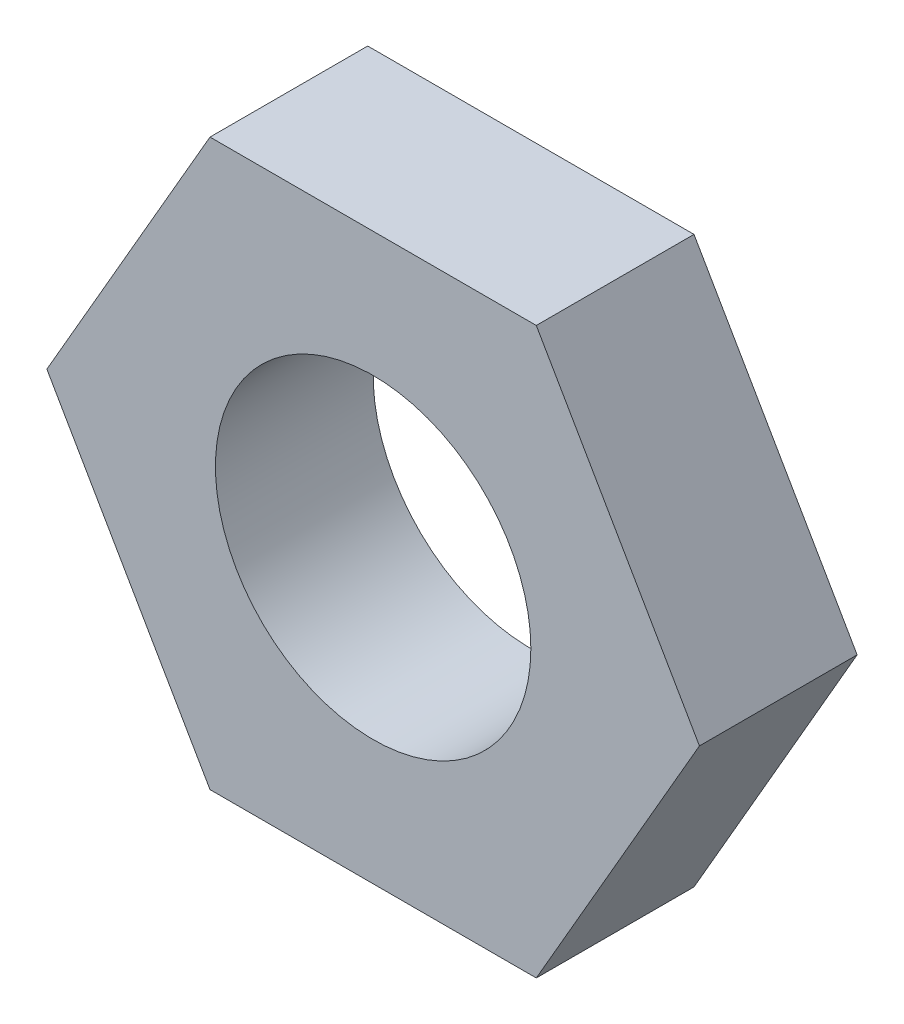
ISO-10303-21;
HEADER;
FILE_DESCRIPTION(('STEP AP214'),'2;1');
FILE_NAME('part.step','',(''),(''),'','','');
FILE_SCHEMA(('AUTOMOTIVE_DESIGN { 1 0 10303 214 1 1 1 1 }'));
ENDSEC;
DATA;
#1=APPLICATION_CONTEXT('core data for automotive mechanical design processes');
#2=APPLICATION_PROTOCOL_DEFINITION('international standard','automotive_design',2000,#1);
#3=PRODUCT_CONTEXT('',#1,'mechanical');
#4=PRODUCT('Part','Part','',(#3));
#5=PRODUCT_RELATED_PRODUCT_CATEGORY('part','',(#4));
#6=PRODUCT_DEFINITION_FORMATION('','',#4);
#7=PRODUCT_DEFINITION_CONTEXT('part definition',#1,'design');
#8=PRODUCT_DEFINITION('design','',#6,#7);
#9=PRODUCT_DEFINITION_SHAPE('','',#8);
#10=(LENGTH_UNIT() NAMED_UNIT(*) SI_UNIT(.MILLI.,.METRE.));
#11=(NAMED_UNIT(*) PLANE_ANGLE_UNIT() SI_UNIT($,.RADIAN.));
#12=(NAMED_UNIT(*) SI_UNIT($,.STERADIAN.) SOLID_ANGLE_UNIT());
#13=UNCERTAINTY_MEASURE_WITH_UNIT(LENGTH_MEASURE(1.E-05),#10,'distance_accuracy_value','');
#14=(GEOMETRIC_REPRESENTATION_CONTEXT(3) GLOBAL_UNCERTAINTY_ASSIGNED_CONTEXT((#13)) GLOBAL_UNIT_ASSIGNED_CONTEXT((#10,
#11,#12)) REPRESENTATION_CONTEXT('',''));
#15=CARTESIAN_POINT('',(0.,0.,0.));
#16=DIRECTION('',(0.,0.,1.));
#17=DIRECTION('',(1.,0.,0.));
#18=AXIS2_PLACEMENT_3D('',#15,#16,#17);
#19=CARTESIAN_POINT('',(0.,0.,3.));
#20=DIRECTION('',(0.,0.,1.));
#21=DIRECTION('',(1.,0.,0.));
#22=AXIS2_PLACEMENT_3D('',#19,#20,#21);
#23=PLANE('',#22);
#24=DIRECTION('',(0.5,0.866025403784439,0.));
#25=VECTOR('',#24,1.);
#26=CARTESIAN_POINT('',(3.10325769689424,-5.37500000000003,3.));
#27=LINE('',#26,#25);
#28=CARTESIAN_POINT('',(3.10325769689424,-5.37500000000003,3.));
#29=VERTEX_POINT('',#28);
#30=CARTESIAN_POINT('',(6.20651539378848,0.,3.));
#31=VERTEX_POINT('',#30);
#32=EDGE_CURVE('E129',#29,#31,#27,.T.);
#33=ORIENTED_EDGE('',*,*,#32,.T.);
#34=DIRECTION('',(-0.5,0.866025403784438,0.));
#35=VECTOR('',#34,1.);
#36=CARTESIAN_POINT('',(6.20651539378848,0.,3.));
#37=LINE('',#36,#35);
#38=CARTESIAN_POINT('',(3.10325769689422,5.375,3.));
#39=VERTEX_POINT('',#38);
#40=EDGE_CURVE('E87',#31,#39,#37,.T.);
#41=ORIENTED_EDGE('',*,*,#40,.T.);
#42=DIRECTION('',(-1.,0.,0.));
#43=VECTOR('',#42,1.);
#44=CARTESIAN_POINT('',(3.10325769689422,5.375,3.));
#45=LINE('',#44,#43);
#46=CARTESIAN_POINT('',(-3.10325769689423,5.375,3.));
#47=VERTEX_POINT('',#46);
#48=EDGE_CURVE('E100',#39,#47,#45,.T.);
#49=ORIENTED_EDGE('',*,*,#48,.T.);
#50=DIRECTION('',(-0.5,-0.866025403784438,0.));
#51=VECTOR('',#50,1.);
#52=CARTESIAN_POINT('',(-3.10325769689423,5.375,3.));
#53=LINE('',#52,#51);
#54=CARTESIAN_POINT('',(-6.20651539378848,0.,3.));
#55=VERTEX_POINT('',#54);
#56=EDGE_CURVE('E94',#47,#55,#53,.T.);
#57=ORIENTED_EDGE('',*,*,#56,.T.);
#58=DIRECTION('',(0.500000000000001,-0.866025403784438,0.));
#59=VECTOR('',#58,1.);
#60=CARTESIAN_POINT('',(-6.20651539378848,0.,3.));
#61=LINE('',#60,#59);
#62=CARTESIAN_POINT('',(-3.10325769689423,-5.37500000000003,3.));
#63=VERTEX_POINT('',#62);
#64=EDGE_CURVE('E98',#55,#63,#61,.T.);
#65=ORIENTED_EDGE('',*,*,#64,.T.);
#66=DIRECTION('',(1.,0.,0.));
#67=VECTOR('',#66,1.);
#68=CARTESIAN_POINT('',(-3.10325769689423,-5.37500000000003,3.));
#69=LINE('',#68,#67);
#70=EDGE_CURVE('E50',#63,#29,#69,.T.);
#71=ORIENTED_EDGE('',*,*,#70,.T.);
#72=EDGE_LOOP('',(#33,#41,#49,#57,#65,#71));
#73=FACE_BOUND('',#72,.T.);
#74=CARTESIAN_POINT('',(0.,0.,3.));
#75=DIRECTION('',(0.,0.,1.));
#76=DIRECTION('',(1.,0.,0.));
#77=AXIS2_PLACEMENT_3D('',#74,#75,#76);
#78=CIRCLE('',#77,3.);
#79=CARTESIAN_POINT('',(3.,0.,3.));
#80=VERTEX_POINT('',#79);
#81=EDGE_CURVE('E122',#80,#80,#78,.T.);
#82=ORIENTED_EDGE('',*,*,#81,.F.);
#83=EDGE_LOOP('',(#82));
#84=FACE_BOUND('',#83,.T.);
#85=ADVANCED_FACE('F33',(#73,#84),#23,.T.);
#86=CARTESIAN_POINT('',(0.,0.,0.));
#87=DIRECTION('',(0.,0.,1.));
#88=DIRECTION('',(1.,0.,0.));
#89=AXIS2_PLACEMENT_3D('',#86,#87,#88);
#90=PLANE('',#89);
#91=DIRECTION('',(0.5,0.866025403784439,0.));
#92=VECTOR('',#91,1.);
#93=CARTESIAN_POINT('',(3.10325769689424,-5.37500000000003,0.));
#94=LINE('',#93,#92);
#95=CARTESIAN_POINT('',(3.10325769689424,-5.37500000000003,0.));
#96=VERTEX_POINT('',#95);
#97=CARTESIAN_POINT('',(6.20651539378848,0.,0.));
#98=VERTEX_POINT('',#97);
#99=EDGE_CURVE('E118',#96,#98,#94,.T.);
#100=ORIENTED_EDGE('',*,*,#99,.F.);
#101=DIRECTION('',(1.,0.,0.));
#102=VECTOR('',#101,1.);
#103=CARTESIAN_POINT('',(-3.10325769689423,-5.37500000000003,0.));
#104=LINE('',#103,#102);
#105=CARTESIAN_POINT('',(-3.10325769689423,-5.37500000000003,0.));
#106=VERTEX_POINT('',#105);
#107=EDGE_CURVE('E79',#106,#96,#104,.T.);
#108=ORIENTED_EDGE('',*,*,#107,.F.);
#109=DIRECTION('',(0.500000000000001,-0.866025403784438,0.));
#110=VECTOR('',#109,1.);
#111=CARTESIAN_POINT('',(-6.20651539378848,0.,0.));
#112=LINE('',#111,#110);
#113=CARTESIAN_POINT('',(-6.20651539378848,0.,0.));
#114=VERTEX_POINT('',#113);
#115=EDGE_CURVE('E73',#114,#106,#112,.T.);
#116=ORIENTED_EDGE('',*,*,#115,.F.);
#117=DIRECTION('',(-0.5,-0.866025403784438,0.));
#118=VECTOR('',#117,1.);
#119=CARTESIAN_POINT('',(-3.10325769689423,5.375,0.));
#120=LINE('',#119,#118);
#121=CARTESIAN_POINT('',(-3.10325769689423,5.375,0.));
#122=VERTEX_POINT('',#121);
#123=EDGE_CURVE('E108',#122,#114,#120,.T.);
#124=ORIENTED_EDGE('',*,*,#123,.F.);
#125=DIRECTION('',(-1.,0.,0.));
#126=VECTOR('',#125,1.);
#127=CARTESIAN_POINT('',(3.10325769689422,5.375,0.));
#128=LINE('',#127,#126);
#129=CARTESIAN_POINT('',(3.10325769689422,5.375,0.));
#130=VERTEX_POINT('',#129);
#131=EDGE_CURVE('E124',#130,#122,#128,.T.);
#132=ORIENTED_EDGE('',*,*,#131,.F.);
#133=DIRECTION('',(-0.5,0.866025403784438,0.));
#134=VECTOR('',#133,1.);
#135=CARTESIAN_POINT('',(6.20651539378848,0.,0.));
#136=LINE('',#135,#134);
#137=EDGE_CURVE('E121',#98,#130,#136,.T.);
#138=ORIENTED_EDGE('',*,*,#137,.F.);
#139=EDGE_LOOP('',(#100,#108,#116,#124,#132,#138));
#140=FACE_BOUND('',#139,.T.);
#141=CARTESIAN_POINT('',(0.,0.,0.));
#142=DIRECTION('',(0.,0.,1.));
#143=DIRECTION('',(1.,0.,0.));
#144=AXIS2_PLACEMENT_3D('',#141,#142,#143);
#145=CIRCLE('',#144,3.);
#146=CARTESIAN_POINT('',(3.,0.,0.));
#147=VERTEX_POINT('',#146);
#148=EDGE_CURVE('E222',#147,#147,#145,.T.);
#149=ORIENTED_EDGE('',*,*,#148,.T.);
#150=EDGE_LOOP('',(#149));
#151=FACE_BOUND('',#150,.T.);
#152=ADVANCED_FACE('F138',(#140,#151),#90,.F.);
#153=CARTESIAN_POINT('',(3.10325769689424,-5.37500000000003,3.));
#154=DIRECTION('',(-0.866025403784439,0.5,0.));
#155=DIRECTION('',(-0.5,-0.866025403784439,0.));
#156=AXIS2_PLACEMENT_3D('',#153,#154,#155);
#157=PLANE('',#156);
#158=ORIENTED_EDGE('',*,*,#99,.T.);
#159=DIRECTION('',(0.,0.,-1.));
#160=VECTOR('',#159,1.);
#161=CARTESIAN_POINT('',(6.20651539378848,0.,3.));
#162=LINE('',#161,#160);
#163=EDGE_CURVE('E11',#31,#98,#162,.T.);
#164=ORIENTED_EDGE('',*,*,#163,.F.);
#165=ORIENTED_EDGE('',*,*,#32,.F.);
#166=DIRECTION('',(0.,0.,-1.));
#167=VECTOR('',#166,1.);
#168=CARTESIAN_POINT('',(3.10325769689424,-5.37500000000003,3.));
#169=LINE('',#168,#167);
#170=EDGE_CURVE('E114',#29,#96,#169,.T.);
#171=ORIENTED_EDGE('',*,*,#170,.T.);
#172=EDGE_LOOP('',(#158,#164,#165,#171));
#173=FACE_BOUND('',#172,.T.);
#174=ADVANCED_FACE('F35',(#173),#157,.F.);
#175=CARTESIAN_POINT('',(6.20651539378848,0.,3.));
#176=DIRECTION('',(-0.866025403784439,-0.5,0.));
#177=DIRECTION('',(0.5,-0.866025403784439,0.));
#178=AXIS2_PLACEMENT_3D('',#175,#176,#177);
#179=PLANE('',#178);
#180=ORIENTED_EDGE('',*,*,#137,.T.);
#181=DIRECTION('',(0.,0.,-1.));
#182=VECTOR('',#181,1.);
#183=CARTESIAN_POINT('',(3.10325769689422,5.375,3.));
#184=LINE('',#183,#182);
#185=EDGE_CURVE('E42',#39,#130,#184,.T.);
#186=ORIENTED_EDGE('',*,*,#185,.F.);
#187=ORIENTED_EDGE('',*,*,#40,.F.);
#188=ORIENTED_EDGE('',*,*,#163,.T.);
#189=EDGE_LOOP('',(#180,#186,#187,#188));
#190=FACE_BOUND('',#189,.T.);
#191=ADVANCED_FACE('F163',(#190),#179,.F.);
#192=CARTESIAN_POINT('',(3.10325769689422,5.375,3.));
#193=DIRECTION('',(0.,-1.,0.));
#194=DIRECTION('',(0.,0.,-1.));
#195=AXIS2_PLACEMENT_3D('',#192,#193,#194);
#196=PLANE('',#195);
#197=ORIENTED_EDGE('',*,*,#131,.T.);
#198=DIRECTION('',(0.,0.,-1.));
#199=VECTOR('',#198,1.);
#200=CARTESIAN_POINT('',(-3.10325769689423,5.375,3.));
#201=LINE('',#200,#199);
#202=EDGE_CURVE('E109',#47,#122,#201,.T.);
#203=ORIENTED_EDGE('',*,*,#202,.F.);
#204=ORIENTED_EDGE('',*,*,#48,.F.);
#205=ORIENTED_EDGE('',*,*,#185,.T.);
#206=EDGE_LOOP('',(#197,#203,#204,#205));
#207=FACE_BOUND('',#206,.T.);
#208=ADVANCED_FACE('F135',(#207),#196,.F.);
#209=CARTESIAN_POINT('',(-3.10325769689423,5.375,3.));
#210=DIRECTION('',(0.866025403784438,-0.500000000000001,0.));
#211=DIRECTION('',(0.500000000000001,0.866025403784438,0.));
#212=AXIS2_PLACEMENT_3D('',#209,#210,#211);
#213=PLANE('',#212);
#214=ORIENTED_EDGE('',*,*,#123,.T.);
#215=DIRECTION('',(0.,0.,-1.));
#216=VECTOR('',#215,1.);
#217=CARTESIAN_POINT('',(-6.20651539378848,0.,3.));
#218=LINE('',#217,#216);
#219=EDGE_CURVE('E105',#55,#114,#218,.T.);
#220=ORIENTED_EDGE('',*,*,#219,.F.);
#221=ORIENTED_EDGE('',*,*,#56,.F.);
#222=ORIENTED_EDGE('',*,*,#202,.T.);
#223=EDGE_LOOP('',(#214,#220,#221,#222));
#224=FACE_BOUND('',#223,.T.);
#225=ADVANCED_FACE('F106',(#224),#213,.F.);
#226=CARTESIAN_POINT('',(-6.20651539378848,0.,3.));
#227=DIRECTION('',(0.866025403784438,0.500000000000001,0.));
#228=DIRECTION('',(-0.500000000000001,0.866025403784438,0.));
#229=AXIS2_PLACEMENT_3D('',#226,#227,#228);
#230=PLANE('',#229);
#231=ORIENTED_EDGE('',*,*,#115,.T.);
#232=DIRECTION('',(0.,0.,-1.));
#233=VECTOR('',#232,1.);
#234=CARTESIAN_POINT('',(-3.10325769689423,-5.37500000000003,3.));
#235=LINE('',#234,#233);
#236=EDGE_CURVE('E110',#63,#106,#235,.T.);
#237=ORIENTED_EDGE('',*,*,#236,.F.);
#238=ORIENTED_EDGE('',*,*,#64,.F.);
#239=ORIENTED_EDGE('',*,*,#219,.T.);
#240=EDGE_LOOP('',(#231,#237,#238,#239));
#241=FACE_BOUND('',#240,.T.);
#242=ADVANCED_FACE('F112',(#241),#230,.F.);
#243=CARTESIAN_POINT('',(-3.10325769689423,-5.37500000000003,3.));
#244=DIRECTION('',(0.,1.,0.));
#245=DIRECTION('',(0.,0.,1.));
#246=AXIS2_PLACEMENT_3D('',#243,#244,#245);
#247=PLANE('',#246);
#248=ORIENTED_EDGE('',*,*,#107,.T.);
#249=ORIENTED_EDGE('',*,*,#170,.F.);
#250=ORIENTED_EDGE('',*,*,#70,.F.);
#251=ORIENTED_EDGE('',*,*,#236,.T.);
#252=EDGE_LOOP('',(#248,#249,#250,#251));
#253=FACE_BOUND('',#252,.T.);
#254=ADVANCED_FACE('F143',(#253),#247,.F.);
#255=CARTESIAN_POINT('',(0.,0.,3.));
#256=DIRECTION('',(0.,0.,-1.));
#257=DIRECTION('',(-1.,0.,0.));
#258=AXIS2_PLACEMENT_3D('',#255,#256,#257);
#259=CYLINDRICAL_SURFACE('',#258,3.);
#260=ORIENTED_EDGE('',*,*,#81,.T.);
#261=EDGE_LOOP('',(#260));
#262=FACE_BOUND('',#261,.T.);
#263=ORIENTED_EDGE('',*,*,#148,.F.);
#264=EDGE_LOOP('',(#263));
#265=FACE_BOUND('',#264,.T.);
#266=ADVANCED_FACE('F145',(#262,#265),#259,.F.);
#267=CLOSED_SHELL('',(#85,#152,#174,#191,#208,#225,#242,#254,#266));
#268=MANIFOLD_SOLID_BREP('B2',#267);
#269=ADVANCED_BREP_SHAPE_REPRESENTATION('',(#18,#268),#14);
#270=SHAPE_DEFINITION_REPRESENTATION(#9,#269);
ENDSEC;
END-ISO-10303-21;
